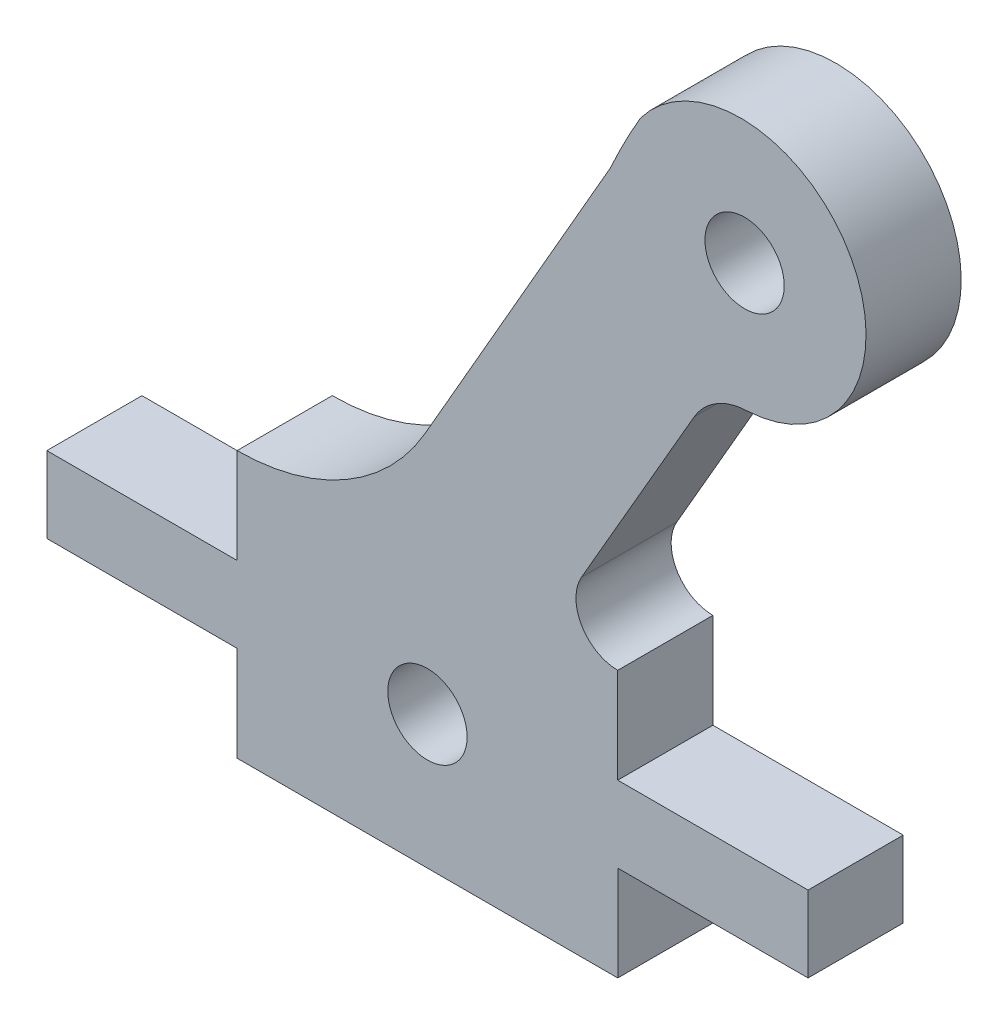
ISO-10303-21;
HEADER;
FILE_DESCRIPTION(('STEP AP214'),'2;1');
FILE_NAME('part.step','',(''),(''),'','','');
FILE_SCHEMA(('AUTOMOTIVE_DESIGN { 1 0 10303 214 1 1 1 1 }'));
ENDSEC;
DATA;
#1=APPLICATION_CONTEXT('core data for automotive mechanical design processes');
#2=APPLICATION_PROTOCOL_DEFINITION('international standard','automotive_design',2000,#1);
#3=PRODUCT_CONTEXT('',#1,'mechanical');
#4=PRODUCT('Part','Part','',(#3));
#5=PRODUCT_RELATED_PRODUCT_CATEGORY('part','',(#4));
#6=PRODUCT_DEFINITION_FORMATION('','',#4);
#7=PRODUCT_DEFINITION_CONTEXT('part definition',#1,'design');
#8=PRODUCT_DEFINITION('design','',#6,#7);
#9=PRODUCT_DEFINITION_SHAPE('','',#8);
#10=(LENGTH_UNIT() NAMED_UNIT(*) SI_UNIT(.MILLI.,.METRE.));
#11=(NAMED_UNIT(*) PLANE_ANGLE_UNIT() SI_UNIT($,.RADIAN.));
#12=(NAMED_UNIT(*) SI_UNIT($,.STERADIAN.) SOLID_ANGLE_UNIT());
#13=UNCERTAINTY_MEASURE_WITH_UNIT(LENGTH_MEASURE(1.E-05),#10,'distance_accuracy_value','');
#14=(GEOMETRIC_REPRESENTATION_CONTEXT(3) GLOBAL_UNCERTAINTY_ASSIGNED_CONTEXT((#13)) GLOBAL_UNIT_ASSIGNED_CONTEXT((#10,
#11,#12)) REPRESENTATION_CONTEXT('',''));
#15=CARTESIAN_POINT('',(0.,0.,0.));
#16=DIRECTION('',(0.,0.,1.));
#17=DIRECTION('',(1.,0.,0.));
#18=AXIS2_PLACEMENT_3D('',#15,#16,#17);
#19=CARTESIAN_POINT('',(194.996929612891,100.808133255801,3.));
#20=DIRECTION('',(0.,0.,1.));
#21=DIRECTION('',(1.,0.,0.));
#22=AXIS2_PLACEMENT_3D('',#19,#20,#21);
#23=PLANE('',#22);
#24=CARTESIAN_POINT('',(188.997425419136,95.2910740345503,3.));
#25=DIRECTION('',(0.,0.,1.));
#26=DIRECTION('',(1.,0.,0.));
#27=AXIS2_PLACEMENT_3D('',#24,#25,#26);
#28=CIRCLE('',#27,1.25000000000004);
#29=CARTESIAN_POINT('',(190.247425419136,95.2910740345503,3.));
#30=VERTEX_POINT('',#29);
#31=EDGE_CURVE('E194',#30,#30,#28,.T.);
#32=ORIENTED_EDGE('',*,*,#31,.F.);
#33=EDGE_LOOP('',(#32));
#34=FACE_BOUND('',#33,.T.);
#35=DIRECTION('',(0.000220609882311119,-0.99999997566564,0.));
#36=VECTOR('',#35,1.);
#37=CARTESIAN_POINT('',(176.997300124418,96.4900442855765,3.));
#38=LINE('',#37,#36);
#39=CARTESIAN_POINT('',(176.997300124418,96.4900442855765,3.));
#40=VERTEX_POINT('',#39);
#41=CARTESIAN_POINT('',(176.997829455042,94.0906476421746,3.));
#42=VERTEX_POINT('',#41);
#43=EDGE_CURVE('E225',#40,#42,#38,.T.);
#44=ORIENTED_EDGE('',*,*,#43,.T.);
#45=DIRECTION('',(1.,0.,0.));
#46=VECTOR('',#45,1.);
#47=CARTESIAN_POINT('',(176.997829455042,94.0906476421746,3.));
#48=LINE('',#47,#46);
#49=CARTESIAN_POINT('',(182.997829455042,94.0906476421746,3.));
#50=VERTEX_POINT('',#49);
#51=EDGE_CURVE('E123',#42,#50,#48,.T.);
#52=ORIENTED_EDGE('',*,*,#51,.T.);
#53=DIRECTION('',(0.,-1.,0.));
#54=VECTOR('',#53,1.);
#55=CARTESIAN_POINT('',(182.997829455042,94.0906476421746,3.));
#56=LINE('',#55,#54);
#57=CARTESIAN_POINT('',(182.997829455042,91.0906476421746,3.));
#58=VERTEX_POINT('',#57);
#59=EDGE_CURVE('E270',#50,#58,#56,.T.);
#60=ORIENTED_EDGE('',*,*,#59,.T.);
#61=DIRECTION('',(1.,0.,0.));
#62=VECTOR('',#61,1.);
#63=CARTESIAN_POINT('',(182.997829455042,91.0906476421746,3.));
#64=LINE('',#63,#62);
#65=CARTESIAN_POINT('',(194.997829455041,91.0906476421746,3.));
#66=VERTEX_POINT('',#65);
#67=EDGE_CURVE('E289',#58,#66,#64,.T.);
#68=ORIENTED_EDGE('',*,*,#67,.T.);
#69=DIRECTION('',(0.,1.,0.));
#70=VECTOR('',#69,1.);
#71=CARTESIAN_POINT('',(194.997829455041,91.0906476421746,3.));
#72=LINE('',#71,#70);
#73=CARTESIAN_POINT('',(194.997829455041,94.0906476421746,3.));
#74=VERTEX_POINT('',#73);
#75=EDGE_CURVE('E286',#66,#74,#72,.T.);
#76=ORIENTED_EDGE('',*,*,#75,.T.);
#77=DIRECTION('',(1.,0.,0.));
#78=VECTOR('',#77,1.);
#79=CARTESIAN_POINT('',(194.997829455041,94.0906476421746,3.));
#80=LINE('',#79,#78);
#81=CARTESIAN_POINT('',(200.997480003679,94.0906476421746,3.));
#82=VERTEX_POINT('',#81);
#83=EDGE_CURVE('E288',#74,#82,#80,.T.);
#84=ORIENTED_EDGE('',*,*,#83,.T.);
#85=DIRECTION('',(-5.30026497254156E-05,0.99999999859536,0.));
#86=VECTOR('',#85,1.);
#87=CARTESIAN_POINT('',(200.997352724358,96.4920241961428,3.));
#88=LINE('',#87,#86);
#89=CARTESIAN_POINT('',(200.997352724358,96.4920241961428,3.));
#90=VERTEX_POINT('',#89);
#91=EDGE_CURVE('E291',#82,#90,#88,.T.);
#92=ORIENTED_EDGE('',*,*,#91,.T.);
#93=DIRECTION('',(-0.999999996597197,-8.24960924929654E-05,0.));
#94=VECTOR('',#93,1.);
#95=CARTESIAN_POINT('',(200.997352724358,96.4920241961428,3.));
#96=LINE('',#95,#94);
#97=CARTESIAN_POINT('',(194.997268863695,96.491529212668,3.));
#98=VERTEX_POINT('',#97);
#99=EDGE_CURVE('E297',#90,#98,#96,.T.);
#100=ORIENTED_EDGE('',*,*,#99,.T.);
#101=DIRECTION('',(-5.89261960132974E-05,0.999999998263852,0.));
#102=VECTOR('',#101,1.);
#103=CARTESIAN_POINT('',(194.997268863695,96.491529212668,3.));
#104=LINE('',#103,#102);
#105=CARTESIAN_POINT('',(194.997092082636,99.491571148833,3.));
#106=VERTEX_POINT('',#105);
#107=EDGE_CURVE('E299',#98,#106,#104,.T.);
#108=ORIENTED_EDGE('',*,*,#107,.T.);
#109=CARTESIAN_POINT('',(194.996929612891,100.808133255801,3.));
#110=DIRECTION('',(0.,0.,-1.));
#111=DIRECTION('',(1.,0.,0.));
#112=AXIS2_PLACEMENT_3D('',#109,#110,#111);
#113=CIRCLE('',#112,1.31656211699297);
#114=CARTESIAN_POINT('',(193.85671948209,101.466355608445,3.));
#115=VERTEX_POINT('',#114);
#116=EDGE_CURVE('E301',#106,#115,#113,.T.);
#117=ORIENTED_EDGE('',*,*,#116,.T.);
#118=DIRECTION('',(0.499921488933329,0.866070727425124,0.));
#119=VECTOR('',#118,1.);
#120=CARTESIAN_POINT('',(193.85671948209,101.466355608445,3.));
#121=LINE('',#120,#119);
#122=CARTESIAN_POINT('',(197.405251992781,107.613881171676,3.));
#123=VERTEX_POINT('',#122);
#124=EDGE_CURVE('E303',#115,#123,#121,.T.);
#125=ORIENTED_EDGE('',*,*,#124,.T.);
#126=CARTESIAN_POINT('',(199.137418021574,106.61391705798,3.));
#127=DIRECTION('',(0.,0.,-1.));
#128=DIRECTION('',(1.,0.,0.));
#129=AXIS2_PLACEMENT_3D('',#126,#127,#128);
#130=CIRCLE('',#129,2.00008184332095);
#131=CARTESIAN_POINT('',(199.090346419336,108.613444913311,3.));
#132=VERTEX_POINT('',#131);
#133=EDGE_CURVE('E305',#123,#132,#130,.T.);
#134=ORIENTED_EDGE('',*,*,#133,.T.);
#135=CARTESIAN_POINT('',(198.874886601451,112.558461432084,3.));
#136=DIRECTION('',(0.,0.,1.));
#137=DIRECTION('',(1.,0.,0.));
#138=AXIS2_PLACEMENT_3D('',#135,#136,#137);
#139=CIRCLE('',#138,3.95089588150789);
#140=CARTESIAN_POINT('',(195.715093083924,114.930229378809,3.));
#141=VERTEX_POINT('',#140);
#142=EDGE_CURVE('E307',#132,#141,#139,.T.);
#143=ORIENTED_EDGE('',*,*,#142,.T.);
#144=CARTESIAN_POINT('',(213.127289572834,104.765338451435,3.));
#145=DIRECTION('',(0.,0.,1.));
#146=DIRECTION('',(1.,0.,0.));
#147=AXIS2_PLACEMENT_3D('',#144,#145,#146);
#148=CIRCLE('',#147,20.1620830802231);
#149=CARTESIAN_POINT('',(194.764370404593,113.090768996125,3.));
#150=VERTEX_POINT('',#149);
#151=EDGE_CURVE('E309',#141,#150,#148,.T.);
#152=ORIENTED_EDGE('',*,*,#151,.T.);
#153=DIRECTION('',(-0.498063420856124,-0.867140604980009,0.));
#154=VECTOR('',#153,1.);
#155=CARTESIAN_POINT('',(194.764370404593,113.090768996125,3.));
#156=LINE('',#155,#154);
#157=CARTESIAN_POINT('',(188.915903996961,102.908445849002,3.));
#158=VERTEX_POINT('',#157);
#159=EDGE_CURVE('E172',#150,#158,#156,.T.);
#160=ORIENTED_EDGE('',*,*,#159,.T.);
#161=CARTESIAN_POINT('',(182.99665481551,106.325156903223,3.));
#162=DIRECTION('',(0.,0.,-1.));
#163=DIRECTION('',(1.,0.,0.));
#164=AXIS2_PLACEMENT_3D('',#161,#162,#163);
#165=CIRCLE('',#164,6.83457572202901);
#166=CARTESIAN_POINT('',(182.997065782668,99.4905811935497,3.));
#167=VERTEX_POINT('',#166);
#168=EDGE_CURVE('E166',#158,#167,#165,.T.);
#169=ORIENTED_EDGE('',*,*,#168,.T.);
#170=DIRECTION('',(0.000106065987992372,-0.999999994375003,0.));
#171=VECTOR('',#170,1.);
#172=CARTESIAN_POINT('',(182.997065782668,99.4905811935497,3.));
#173=LINE('',#172,#171);
#174=CARTESIAN_POINT('',(182.99738398508,96.4905392690514,3.));
#175=VERTEX_POINT('',#174);
#176=EDGE_CURVE('E170',#167,#175,#173,.T.);
#177=ORIENTED_EDGE('',*,*,#176,.T.);
#178=DIRECTION('',(-0.999999996597197,-8.24960925068426E-05,0.));
#179=VECTOR('',#178,1.);
#180=CARTESIAN_POINT('',(182.99738398508,96.4905392690514,3.));
#181=LINE('',#180,#179);
#182=EDGE_CURVE('E50',#175,#40,#181,.T.);
#183=ORIENTED_EDGE('',*,*,#182,.T.);
#184=EDGE_LOOP('',(#44,#52,#60,#68,#76,#84,#92,#100,#108,#117,#125,#134,#143,#152,#160,#169,
#177,#183));
#185=FACE_BOUND('',#184,.T.);
#186=CARTESIAN_POINT('',(198.996042034731,112.6123381241,3.));
#187=DIRECTION('',(0.,0.,1.));
#188=DIRECTION('',(1.,0.,0.));
#189=AXIS2_PLACEMENT_3D('',#186,#187,#188);
#190=CIRCLE('',#189,1.25000000000001);
#191=CARTESIAN_POINT('',(200.246042034731,112.6123381241,3.));
#192=VERTEX_POINT('',#191);
#193=EDGE_CURVE('E351',#192,#192,#190,.T.);
#194=ORIENTED_EDGE('',*,*,#193,.F.);
#195=EDGE_LOOP('',(#194));
#196=FACE_BOUND('',#195,.T.);
#197=ADVANCED_FACE('F33',(#34,#185,#196),#23,.T.);
#198=CARTESIAN_POINT('',(194.996929612891,100.808133255801,0.));
#199=DIRECTION('',(0.,0.,1.));
#200=DIRECTION('',(1.,0.,0.));
#201=AXIS2_PLACEMENT_3D('',#198,#199,#200);
#202=PLANE('',#201);
#203=DIRECTION('',(0.000220609882311119,-0.99999997566564,0.));
#204=VECTOR('',#203,1.);
#205=CARTESIAN_POINT('',(176.997300124418,96.4900442855765,0.));
#206=LINE('',#205,#204);
#207=CARTESIAN_POINT('',(176.997300124418,96.4900442855765,0.));
#208=VERTEX_POINT('',#207);
#209=CARTESIAN_POINT('',(176.997829455042,94.0906476421746,0.));
#210=VERTEX_POINT('',#209);
#211=EDGE_CURVE('E190',#208,#210,#206,.T.);
#212=ORIENTED_EDGE('',*,*,#211,.F.);
#213=DIRECTION('',(-0.999999996597197,-8.24960925068426E-05,0.));
#214=VECTOR('',#213,1.);
#215=CARTESIAN_POINT('',(182.99738398508,96.4905392690514,0.));
#216=LINE('',#215,#214);
#217=CARTESIAN_POINT('',(182.99738398508,96.4905392690514,0.));
#218=VERTEX_POINT('',#217);
#219=EDGE_CURVE('E115',#218,#208,#216,.T.);
#220=ORIENTED_EDGE('',*,*,#219,.F.);
#221=DIRECTION('',(0.000106065987992372,-0.999999994375003,0.));
#222=VECTOR('',#221,1.);
#223=CARTESIAN_POINT('',(182.997065782668,99.4905811935497,0.));
#224=LINE('',#223,#222);
#225=CARTESIAN_POINT('',(182.997065782668,99.4905811935497,0.));
#226=VERTEX_POINT('',#225);
#227=EDGE_CURVE('E109',#226,#218,#224,.T.);
#228=ORIENTED_EDGE('',*,*,#227,.F.);
#229=CARTESIAN_POINT('',(182.99665481551,106.325156903223,0.));
#230=DIRECTION('',(0.,0.,-1.));
#231=DIRECTION('',(1.,0.,0.));
#232=AXIS2_PLACEMENT_3D('',#229,#230,#231);
#233=CIRCLE('',#232,6.83457572202901);
#234=CARTESIAN_POINT('',(188.915903996961,102.908445849002,0.));
#235=VERTEX_POINT('',#234);
#236=EDGE_CURVE('E180',#235,#226,#233,.T.);
#237=ORIENTED_EDGE('',*,*,#236,.F.);
#238=DIRECTION('',(-0.498063420856124,-0.867140604980009,0.));
#239=VECTOR('',#238,1.);
#240=CARTESIAN_POINT('',(194.764370404593,113.090768996125,0.));
#241=LINE('',#240,#239);
#242=CARTESIAN_POINT('',(194.764370404593,113.090768996125,0.));
#243=VERTEX_POINT('',#242);
#244=EDGE_CURVE('E220',#243,#235,#241,.T.);
#245=ORIENTED_EDGE('',*,*,#244,.F.);
#246=CARTESIAN_POINT('',(213.127289572834,104.765338451435,0.));
#247=DIRECTION('',(0.,0.,1.));
#248=DIRECTION('',(1.,0.,0.));
#249=AXIS2_PLACEMENT_3D('',#246,#247,#248);
#250=CIRCLE('',#249,20.1620830802231);
#251=CARTESIAN_POINT('',(195.715093083924,114.930229378809,0.));
#252=VERTEX_POINT('',#251);
#253=EDGE_CURVE('E218',#252,#243,#250,.T.);
#254=ORIENTED_EDGE('',*,*,#253,.F.);
#255=CARTESIAN_POINT('',(198.874886601451,112.558461432084,0.));
#256=DIRECTION('',(0.,0.,1.));
#257=DIRECTION('',(1.,0.,0.));
#258=AXIS2_PLACEMENT_3D('',#255,#256,#257);
#259=CIRCLE('',#258,3.95089588150789);
#260=CARTESIAN_POINT('',(199.090346419336,108.613444913311,0.));
#261=VERTEX_POINT('',#260);
#262=EDGE_CURVE('E216',#261,#252,#259,.T.);
#263=ORIENTED_EDGE('',*,*,#262,.F.);
#264=CARTESIAN_POINT('',(199.137418021574,106.61391705798,0.));
#265=DIRECTION('',(0.,0.,-1.));
#266=DIRECTION('',(1.,0.,0.));
#267=AXIS2_PLACEMENT_3D('',#264,#265,#266);
#268=CIRCLE('',#267,2.00008184332095);
#269=CARTESIAN_POINT('',(197.405251992781,107.613881171676,0.));
#270=VERTEX_POINT('',#269);
#271=EDGE_CURVE('E214',#270,#261,#268,.T.);
#272=ORIENTED_EDGE('',*,*,#271,.F.);
#273=DIRECTION('',(0.499921488933329,0.866070727425124,0.));
#274=VECTOR('',#273,1.);
#275=CARTESIAN_POINT('',(193.85671948209,101.466355608445,0.));
#276=LINE('',#275,#274);
#277=CARTESIAN_POINT('',(193.85671948209,101.466355608445,0.));
#278=VERTEX_POINT('',#277);
#279=EDGE_CURVE('E212',#278,#270,#276,.T.);
#280=ORIENTED_EDGE('',*,*,#279,.F.);
#281=CARTESIAN_POINT('',(194.996929612891,100.808133255801,0.));
#282=DIRECTION('',(0.,0.,-1.));
#283=DIRECTION('',(1.,0.,0.));
#284=AXIS2_PLACEMENT_3D('',#281,#282,#283);
#285=CIRCLE('',#284,1.31656211699297);
#286=CARTESIAN_POINT('',(194.997092082636,99.491571148833,0.));
#287=VERTEX_POINT('',#286);
#288=EDGE_CURVE('E210',#287,#278,#285,.T.);
#289=ORIENTED_EDGE('',*,*,#288,.F.);
#290=DIRECTION('',(-5.89261960132974E-05,0.999999998263852,0.));
#291=VECTOR('',#290,1.);
#292=CARTESIAN_POINT('',(194.997268863695,96.491529212668,0.));
#293=LINE('',#292,#291);
#294=CARTESIAN_POINT('',(194.997268863695,96.491529212668,0.));
#295=VERTEX_POINT('',#294);
#296=EDGE_CURVE('E208',#295,#287,#293,.T.);
#297=ORIENTED_EDGE('',*,*,#296,.F.);
#298=DIRECTION('',(-0.999999996597197,-8.24960924929654E-05,0.));
#299=VECTOR('',#298,1.);
#300=CARTESIAN_POINT('',(200.997352724358,96.4920241961428,0.));
#301=LINE('',#300,#299);
#302=CARTESIAN_POINT('',(200.997352724358,96.4920241961428,0.));
#303=VERTEX_POINT('',#302);
#304=EDGE_CURVE('E206',#303,#295,#301,.T.);
#305=ORIENTED_EDGE('',*,*,#304,.F.);
#306=DIRECTION('',(-5.30026497254156E-05,0.99999999859536,0.));
#307=VECTOR('',#306,1.);
#308=CARTESIAN_POINT('',(200.997352724358,96.4920241961428,0.));
#309=LINE('',#308,#307);
#310=CARTESIAN_POINT('',(200.997480003679,94.0906476421746,0.));
#311=VERTEX_POINT('',#310);
#312=EDGE_CURVE('E204',#311,#303,#309,.T.);
#313=ORIENTED_EDGE('',*,*,#312,.F.);
#314=DIRECTION('',(1.,0.,0.));
#315=VECTOR('',#314,1.);
#316=CARTESIAN_POINT('',(194.997829455041,94.0906476421746,0.));
#317=LINE('',#316,#315);
#318=CARTESIAN_POINT('',(194.997829455041,94.0906476421746,0.));
#319=VERTEX_POINT('',#318);
#320=EDGE_CURVE('E202',#319,#311,#317,.T.);
#321=ORIENTED_EDGE('',*,*,#320,.F.);
#322=DIRECTION('',(0.,1.,0.));
#323=VECTOR('',#322,1.);
#324=CARTESIAN_POINT('',(194.997829455041,91.0906476421746,0.));
#325=LINE('',#324,#323);
#326=CARTESIAN_POINT('',(194.997829455041,91.0906476421746,0.));
#327=VERTEX_POINT('',#326);
#328=EDGE_CURVE('E200',#327,#319,#325,.T.);
#329=ORIENTED_EDGE('',*,*,#328,.F.);
#330=DIRECTION('',(1.,0.,0.));
#331=VECTOR('',#330,1.);
#332=CARTESIAN_POINT('',(182.997829455042,91.0906476421746,0.));
#333=LINE('',#332,#331);
#334=CARTESIAN_POINT('',(182.997829455042,91.0906476421746,0.));
#335=VERTEX_POINT('',#334);
#336=EDGE_CURVE('E198',#335,#327,#333,.T.);
#337=ORIENTED_EDGE('',*,*,#336,.F.);
#338=DIRECTION('',(0.,-1.,0.));
#339=VECTOR('',#338,1.);
#340=CARTESIAN_POINT('',(182.997829455042,94.0906476421746,0.));
#341=LINE('',#340,#339);
#342=CARTESIAN_POINT('',(182.997829455042,94.0906476421746,0.));
#343=VERTEX_POINT('',#342);
#344=EDGE_CURVE('E196',#343,#335,#341,.T.);
#345=ORIENTED_EDGE('',*,*,#344,.F.);
#346=DIRECTION('',(1.,0.,0.));
#347=VECTOR('',#346,1.);
#348=CARTESIAN_POINT('',(176.997829455042,94.0906476421746,0.));
#349=LINE('',#348,#347);
#350=EDGE_CURVE('E193',#210,#343,#349,.T.);
#351=ORIENTED_EDGE('',*,*,#350,.F.);
#352=EDGE_LOOP('',(#212,#220,#228,#237,#245,#254,#263,#272,#280,#289,#297,#305,#313,#321,#329,
#337,#345,#351));
#353=FACE_BOUND('',#352,.T.);
#354=CARTESIAN_POINT('',(188.997425419136,95.2910740345503,0.));
#355=DIRECTION('',(0.,0.,1.));
#356=DIRECTION('',(1.,0.,0.));
#357=AXIS2_PLACEMENT_3D('',#354,#355,#356);
#358=CIRCLE('',#357,1.25000000000004);
#359=CARTESIAN_POINT('',(190.247425419136,95.2910740345503,0.));
#360=VERTEX_POINT('',#359);
#361=EDGE_CURVE('E357',#360,#360,#358,.T.);
#362=ORIENTED_EDGE('',*,*,#361,.T.);
#363=EDGE_LOOP('',(#362));
#364=FACE_BOUND('',#363,.T.);
#365=CARTESIAN_POINT('',(198.996042034731,112.6123381241,0.));
#366=DIRECTION('',(0.,0.,1.));
#367=DIRECTION('',(1.,0.,0.));
#368=AXIS2_PLACEMENT_3D('',#365,#366,#367);
#369=CIRCLE('',#368,1.25000000000001);
#370=CARTESIAN_POINT('',(200.246042034731,112.6123381241,0.));
#371=VERTEX_POINT('',#370);
#372=EDGE_CURVE('E354',#371,#371,#369,.T.);
#373=ORIENTED_EDGE('',*,*,#372,.T.);
#374=EDGE_LOOP('',(#373));
#375=FACE_BOUND('',#374,.T.);
#376=ADVANCED_FACE('F274',(#353,#364,#375),#202,.F.);
#377=CARTESIAN_POINT('',(176.997300124418,96.4900442855765,3.));
#378=DIRECTION('',(0.999999975665639,0.000220609882311119,0.));
#379=DIRECTION('',(-0.000220609882311119,0.99999997566564,0.));
#380=AXIS2_PLACEMENT_3D('',#377,#378,#379);
#381=PLANE('',#380);
#382=ORIENTED_EDGE('',*,*,#211,.T.);
#383=DIRECTION('',(0.,0.,-1.));
#384=VECTOR('',#383,1.);
#385=CARTESIAN_POINT('',(176.997829455042,94.0906476421746,3.));
#386=LINE('',#385,#384);
#387=EDGE_CURVE('E11',#42,#210,#386,.T.);
#388=ORIENTED_EDGE('',*,*,#387,.F.);
#389=ORIENTED_EDGE('',*,*,#43,.F.);
#390=DIRECTION('',(0.,0.,-1.));
#391=VECTOR('',#390,1.);
#392=CARTESIAN_POINT('',(176.997300124418,96.4900442855765,3.));
#393=LINE('',#392,#391);
#394=EDGE_CURVE('E186',#40,#208,#393,.T.);
#395=ORIENTED_EDGE('',*,*,#394,.T.);
#396=EDGE_LOOP('',(#382,#388,#389,#395));
#397=FACE_BOUND('',#396,.T.);
#398=ADVANCED_FACE('F35',(#397),#381,.F.);
#399=CARTESIAN_POINT('',(176.997829455042,94.0906476421746,3.));
#400=DIRECTION('',(0.,1.,0.));
#401=DIRECTION('',(0.,0.,1.));
#402=AXIS2_PLACEMENT_3D('',#399,#400,#401);
#403=PLANE('',#402);
#404=ORIENTED_EDGE('',*,*,#350,.T.);
#405=DIRECTION('',(0.,0.,-1.));
#406=VECTOR('',#405,1.);
#407=CARTESIAN_POINT('',(182.997829455042,94.0906476421746,3.));
#408=LINE('',#407,#406);
#409=EDGE_CURVE('E42',#50,#343,#408,.T.);
#410=ORIENTED_EDGE('',*,*,#409,.F.);
#411=ORIENTED_EDGE('',*,*,#51,.F.);
#412=ORIENTED_EDGE('',*,*,#387,.T.);
#413=EDGE_LOOP('',(#404,#410,#411,#412));
#414=FACE_BOUND('',#413,.T.);
#415=ADVANCED_FACE('F510',(#414),#403,.F.);
#416=CARTESIAN_POINT('',(182.997829455042,94.0906476421746,3.));
#417=DIRECTION('',(1.,0.,0.));
#418=DIRECTION('',(0.,0.,-1.));
#419=AXIS2_PLACEMENT_3D('',#416,#417,#418);
#420=PLANE('',#419);
#421=ORIENTED_EDGE('',*,*,#344,.T.);
#422=DIRECTION('',(0.,0.,-1.));
#423=VECTOR('',#422,1.);
#424=CARTESIAN_POINT('',(182.997829455042,91.0906476421746,3.));
#425=LINE('',#424,#423);
#426=EDGE_CURVE('E262',#58,#335,#425,.T.);
#427=ORIENTED_EDGE('',*,*,#426,.F.);
#428=ORIENTED_EDGE('',*,*,#59,.F.);
#429=ORIENTED_EDGE('',*,*,#409,.T.);
#430=EDGE_LOOP('',(#421,#427,#428,#429));
#431=FACE_BOUND('',#430,.T.);
#432=ADVANCED_FACE('F268',(#431),#420,.F.);
#433=CARTESIAN_POINT('',(182.997829455042,91.0906476421746,3.));
#434=DIRECTION('',(0.,1.,0.));
#435=DIRECTION('',(0.,0.,1.));
#436=AXIS2_PLACEMENT_3D('',#433,#434,#435);
#437=PLANE('',#436);
#438=ORIENTED_EDGE('',*,*,#336,.T.);
#439=DIRECTION('',(0.,0.,-1.));
#440=VECTOR('',#439,1.);
#441=CARTESIAN_POINT('',(194.997829455041,91.0906476421746,3.));
#442=LINE('',#441,#440);
#443=EDGE_CURVE('E259',#66,#327,#442,.T.);
#444=ORIENTED_EDGE('',*,*,#443,.F.);
#445=ORIENTED_EDGE('',*,*,#67,.F.);
#446=ORIENTED_EDGE('',*,*,#426,.T.);
#447=EDGE_LOOP('',(#438,#444,#445,#446));
#448=FACE_BOUND('',#447,.T.);
#449=ADVANCED_FACE('F280',(#448),#437,.F.);
#450=CARTESIAN_POINT('',(194.997829455041,91.0906476421746,3.));
#451=DIRECTION('',(-1.,0.,0.));
#452=DIRECTION('',(0.,0.,1.));
#453=AXIS2_PLACEMENT_3D('',#450,#451,#452);
#454=PLANE('',#453);
#455=ORIENTED_EDGE('',*,*,#328,.T.);
#456=DIRECTION('',(0.,0.,-1.));
#457=VECTOR('',#456,1.);
#458=CARTESIAN_POINT('',(194.997829455041,94.0906476421746,3.));
#459=LINE('',#458,#457);
#460=EDGE_CURVE('E256',#74,#319,#459,.T.);
#461=ORIENTED_EDGE('',*,*,#460,.F.);
#462=ORIENTED_EDGE('',*,*,#75,.F.);
#463=ORIENTED_EDGE('',*,*,#443,.T.);
#464=EDGE_LOOP('',(#455,#461,#462,#463));
#465=FACE_BOUND('',#464,.T.);
#466=ADVANCED_FACE('F284',(#465),#454,.F.);
#467=CARTESIAN_POINT('',(194.997829455041,94.0906476421746,3.));
#468=DIRECTION('',(0.,1.,0.));
#469=DIRECTION('',(0.,0.,1.));
#470=AXIS2_PLACEMENT_3D('',#467,#468,#469);
#471=PLANE('',#470);
#472=ORIENTED_EDGE('',*,*,#320,.T.);
#473=DIRECTION('',(0.,0.,-1.));
#474=VECTOR('',#473,1.);
#475=CARTESIAN_POINT('',(200.997480003679,94.0906476421746,3.));
#476=LINE('',#475,#474);
#477=EDGE_CURVE('E253',#82,#311,#476,.T.);
#478=ORIENTED_EDGE('',*,*,#477,.F.);
#479=ORIENTED_EDGE('',*,*,#83,.F.);
#480=ORIENTED_EDGE('',*,*,#460,.T.);
#481=EDGE_LOOP('',(#472,#478,#479,#480));
#482=FACE_BOUND('',#481,.T.);
#483=ADVANCED_FACE('F475',(#482),#471,.F.);
#484=CARTESIAN_POINT('',(200.997352724358,96.4920241961428,3.));
#485=DIRECTION('',(-0.999999998595359,-5.30026497254156E-05,0.));
#486=DIRECTION('',(5.30026497254156E-05,-0.99999999859536,0.));
#487=AXIS2_PLACEMENT_3D('',#484,#485,#486);
#488=PLANE('',#487);
#489=ORIENTED_EDGE('',*,*,#312,.T.);
#490=DIRECTION('',(0.,0.,-1.));
#491=VECTOR('',#490,1.);
#492=CARTESIAN_POINT('',(200.997352724358,96.4920241961428,3.));
#493=LINE('',#492,#491);
#494=EDGE_CURVE('E250',#90,#303,#493,.T.);
#495=ORIENTED_EDGE('',*,*,#494,.F.);
#496=ORIENTED_EDGE('',*,*,#91,.F.);
#497=ORIENTED_EDGE('',*,*,#477,.T.);
#498=EDGE_LOOP('',(#489,#495,#496,#497));
#499=FACE_BOUND('',#498,.T.);
#500=ADVANCED_FACE('F465',(#499),#488,.F.);
#501=CARTESIAN_POINT('',(200.997352724358,96.4920241961428,3.));
#502=DIRECTION('',(8.24960924929654E-05,-0.999999996597197,0.));
#503=DIRECTION('',(0.999999996597197,8.24960924929654E-05,0.));
#504=AXIS2_PLACEMENT_3D('',#501,#502,#503);
#505=PLANE('',#504);
#506=ORIENTED_EDGE('',*,*,#304,.T.);
#507=DIRECTION('',(0.,0.,-1.));
#508=VECTOR('',#507,1.);
#509=CARTESIAN_POINT('',(194.997268863695,96.491529212668,3.));
#510=LINE('',#509,#508);
#511=EDGE_CURVE('E247',#98,#295,#510,.T.);
#512=ORIENTED_EDGE('',*,*,#511,.F.);
#513=ORIENTED_EDGE('',*,*,#99,.F.);
#514=ORIENTED_EDGE('',*,*,#494,.T.);
#515=EDGE_LOOP('',(#506,#512,#513,#514));
#516=FACE_BOUND('',#515,.T.);
#517=ADVANCED_FACE('F455',(#516),#505,.F.);
#518=CARTESIAN_POINT('',(194.997268863695,96.491529212668,3.));
#519=DIRECTION('',(-0.999999998263852,-5.89261960132974E-05,0.));
#520=DIRECTION('',(5.89261960132974E-05,-0.999999998263852,0.));
#521=AXIS2_PLACEMENT_3D('',#518,#519,#520);
#522=PLANE('',#521);
#523=ORIENTED_EDGE('',*,*,#296,.T.);
#524=DIRECTION('',(0.,0.,-1.));
#525=VECTOR('',#524,1.);
#526=CARTESIAN_POINT('',(194.997092082636,99.491571148833,3.));
#527=LINE('',#526,#525);
#528=EDGE_CURVE('E244',#106,#287,#527,.T.);
#529=ORIENTED_EDGE('',*,*,#528,.F.);
#530=ORIENTED_EDGE('',*,*,#107,.F.);
#531=ORIENTED_EDGE('',*,*,#511,.T.);
#532=EDGE_LOOP('',(#523,#529,#530,#531));
#533=FACE_BOUND('',#532,.T.);
#534=ADVANCED_FACE('F445',(#533),#522,.F.);
#535=CARTESIAN_POINT('',(194.996929612891,100.808133255801,3.));
#536=DIRECTION('',(0.,0.,-1.));
#537=DIRECTION('',(-1.,0.,0.));
#538=AXIS2_PLACEMENT_3D('',#535,#536,#537);
#539=CYLINDRICAL_SURFACE('',#538,1.31656211699297);
#540=ORIENTED_EDGE('',*,*,#288,.T.);
#541=DIRECTION('',(0.,0.,-1.));
#542=VECTOR('',#541,1.);
#543=CARTESIAN_POINT('',(193.85671948209,101.466355608445,3.));
#544=LINE('',#543,#542);
#545=EDGE_CURVE('E241',#115,#278,#544,.T.);
#546=ORIENTED_EDGE('',*,*,#545,.F.);
#547=ORIENTED_EDGE('',*,*,#116,.F.);
#548=ORIENTED_EDGE('',*,*,#528,.T.);
#549=EDGE_LOOP('',(#540,#546,#547,#548));
#550=FACE_BOUND('',#549,.T.);
#551=ADVANCED_FACE('F435',(#550),#539,.F.);
#552=CARTESIAN_POINT('',(193.85671948209,101.466355608445,3.));
#553=DIRECTION('',(-0.866070727425124,0.499921488933329,0.));
#554=DIRECTION('',(-0.499921488933329,-0.866070727425124,0.));
#555=AXIS2_PLACEMENT_3D('',#552,#553,#554);
#556=PLANE('',#555);
#557=ORIENTED_EDGE('',*,*,#279,.T.);
#558=DIRECTION('',(0.,0.,-1.));
#559=VECTOR('',#558,1.);
#560=CARTESIAN_POINT('',(197.405251992781,107.613881171676,3.));
#561=LINE('',#560,#559);
#562=EDGE_CURVE('E238',#123,#270,#561,.T.);
#563=ORIENTED_EDGE('',*,*,#562,.F.);
#564=ORIENTED_EDGE('',*,*,#124,.F.);
#565=ORIENTED_EDGE('',*,*,#545,.T.);
#566=EDGE_LOOP('',(#557,#563,#564,#565));
#567=FACE_BOUND('',#566,.T.);
#568=ADVANCED_FACE('F425',(#567),#556,.F.);
#569=CARTESIAN_POINT('',(199.137418021574,106.61391705798,3.));
#570=DIRECTION('',(0.,0.,-1.));
#571=DIRECTION('',(-1.,0.,0.));
#572=AXIS2_PLACEMENT_3D('',#569,#570,#571);
#573=CYLINDRICAL_SURFACE('',#572,2.00008184332095);
#574=ORIENTED_EDGE('',*,*,#271,.T.);
#575=DIRECTION('',(0.,0.,-1.));
#576=VECTOR('',#575,1.);
#577=CARTESIAN_POINT('',(199.090346419336,108.613444913311,3.));
#578=LINE('',#577,#576);
#579=EDGE_CURVE('E235',#132,#261,#578,.T.);
#580=ORIENTED_EDGE('',*,*,#579,.F.);
#581=ORIENTED_EDGE('',*,*,#133,.F.);
#582=ORIENTED_EDGE('',*,*,#562,.T.);
#583=EDGE_LOOP('',(#574,#580,#581,#582));
#584=FACE_BOUND('',#583,.T.);
#585=ADVANCED_FACE('F415',(#584),#573,.F.);
#586=CARTESIAN_POINT('',(198.874886601451,112.558461432084,3.));
#587=DIRECTION('',(0.,0.,-1.));
#588=DIRECTION('',(-1.,0.,0.));
#589=AXIS2_PLACEMENT_3D('',#586,#587,#588);
#590=CYLINDRICAL_SURFACE('',#589,3.95089588150789);
#591=ORIENTED_EDGE('',*,*,#262,.T.);
#592=DIRECTION('',(0.,0.,-1.));
#593=VECTOR('',#592,1.);
#594=CARTESIAN_POINT('',(195.715093083924,114.930229378809,3.));
#595=LINE('',#594,#593);
#596=EDGE_CURVE('E232',#141,#252,#595,.T.);
#597=ORIENTED_EDGE('',*,*,#596,.F.);
#598=ORIENTED_EDGE('',*,*,#142,.F.);
#599=ORIENTED_EDGE('',*,*,#579,.T.);
#600=EDGE_LOOP('',(#591,#597,#598,#599));
#601=FACE_BOUND('',#600,.T.);
#602=ADVANCED_FACE('F406',(#601),#590,.T.);
#603=CARTESIAN_POINT('',(213.127289572834,104.765338451435,3.));
#604=DIRECTION('',(0.,0.,-1.));
#605=DIRECTION('',(-1.,0.,0.));
#606=AXIS2_PLACEMENT_3D('',#603,#604,#605);
#607=CYLINDRICAL_SURFACE('',#606,20.1620830802231);
#608=ORIENTED_EDGE('',*,*,#253,.T.);
#609=DIRECTION('',(0.,0.,-1.));
#610=VECTOR('',#609,1.);
#611=CARTESIAN_POINT('',(194.764370404593,113.090768996125,3.));
#612=LINE('',#611,#610);
#613=EDGE_CURVE('E229',#150,#243,#612,.T.);
#614=ORIENTED_EDGE('',*,*,#613,.F.);
#615=ORIENTED_EDGE('',*,*,#151,.F.);
#616=ORIENTED_EDGE('',*,*,#596,.T.);
#617=EDGE_LOOP('',(#608,#614,#615,#616));
#618=FACE_BOUND('',#617,.T.);
#619=ADVANCED_FACE('F315',(#618),#607,.T.);
#620=CARTESIAN_POINT('',(194.764370404593,113.090768996125,3.));
#621=DIRECTION('',(0.867140604980008,-0.498063420856124,0.));
#622=DIRECTION('',(0.498063420856124,0.867140604980009,0.));
#623=AXIS2_PLACEMENT_3D('',#620,#621,#622);
#624=PLANE('',#623);
#625=ORIENTED_EDGE('',*,*,#244,.T.);
#626=DIRECTION('',(0.,0.,-1.));
#627=VECTOR('',#626,1.);
#628=CARTESIAN_POINT('',(188.915903996961,102.908445849002,3.));
#629=LINE('',#628,#627);
#630=EDGE_CURVE('E181',#158,#235,#629,.T.);
#631=ORIENTED_EDGE('',*,*,#630,.F.);
#632=ORIENTED_EDGE('',*,*,#159,.F.);
#633=ORIENTED_EDGE('',*,*,#613,.T.);
#634=EDGE_LOOP('',(#625,#631,#632,#633));
#635=FACE_BOUND('',#634,.T.);
#636=ADVANCED_FACE('F319',(#635),#624,.F.);
#637=CARTESIAN_POINT('',(182.99665481551,106.325156903223,3.));
#638=DIRECTION('',(0.,0.,-1.));
#639=DIRECTION('',(-1.,0.,0.));
#640=AXIS2_PLACEMENT_3D('',#637,#638,#639);
#641=CYLINDRICAL_SURFACE('',#640,6.83457572202901);
#642=ORIENTED_EDGE('',*,*,#236,.T.);
#643=DIRECTION('',(0.,0.,-1.));
#644=VECTOR('',#643,1.);
#645=CARTESIAN_POINT('',(182.997065782668,99.4905811935497,3.));
#646=LINE('',#645,#644);
#647=EDGE_CURVE('E177',#167,#226,#646,.T.);
#648=ORIENTED_EDGE('',*,*,#647,.F.);
#649=ORIENTED_EDGE('',*,*,#168,.F.);
#650=ORIENTED_EDGE('',*,*,#630,.T.);
#651=EDGE_LOOP('',(#642,#648,#649,#650));
#652=FACE_BOUND('',#651,.T.);
#653=ADVANCED_FACE('F178',(#652),#641,.F.);
#654=CARTESIAN_POINT('',(182.997065782668,99.4905811935497,3.));
#655=DIRECTION('',(0.999999994375003,0.000106065987992372,0.));
#656=DIRECTION('',(-0.000106065987992372,0.999999994375003,0.));
#657=AXIS2_PLACEMENT_3D('',#654,#655,#656);
#658=PLANE('',#657);
#659=ORIENTED_EDGE('',*,*,#227,.T.);
#660=DIRECTION('',(0.,0.,-1.));
#661=VECTOR('',#660,1.);
#662=CARTESIAN_POINT('',(182.99738398508,96.4905392690514,3.));
#663=LINE('',#662,#661);
#664=EDGE_CURVE('E182',#175,#218,#663,.T.);
#665=ORIENTED_EDGE('',*,*,#664,.F.);
#666=ORIENTED_EDGE('',*,*,#176,.F.);
#667=ORIENTED_EDGE('',*,*,#647,.T.);
#668=EDGE_LOOP('',(#659,#665,#666,#667));
#669=FACE_BOUND('',#668,.T.);
#670=ADVANCED_FACE('F184',(#669),#658,.F.);
#671=CARTESIAN_POINT('',(182.99738398508,96.4905392690514,3.));
#672=DIRECTION('',(8.24960925068426E-05,-0.999999996597197,0.));
#673=DIRECTION('',(0.999999996597197,8.24960925068426E-05,0.));
#674=AXIS2_PLACEMENT_3D('',#671,#672,#673);
#675=PLANE('',#674);
#676=ORIENTED_EDGE('',*,*,#219,.T.);
#677=ORIENTED_EDGE('',*,*,#394,.F.);
#678=ORIENTED_EDGE('',*,*,#182,.F.);
#679=ORIENTED_EDGE('',*,*,#664,.T.);
#680=EDGE_LOOP('',(#676,#677,#678,#679));
#681=FACE_BOUND('',#680,.T.);
#682=ADVANCED_FACE('F323',(#681),#675,.F.);
#683=CARTESIAN_POINT('',(188.997425419136,95.2910740345503,3.));
#684=DIRECTION('',(0.,0.,-1.));
#685=DIRECTION('',(-1.,0.,0.));
#686=AXIS2_PLACEMENT_3D('',#683,#684,#685);
#687=CYLINDRICAL_SURFACE('',#686,1.25000000000004);
#688=ORIENTED_EDGE('',*,*,#31,.T.);
#689=EDGE_LOOP('',(#688));
#690=FACE_BOUND('',#689,.T.);
#691=ORIENTED_EDGE('',*,*,#361,.F.);
#692=EDGE_LOOP('',(#691));
#693=FACE_BOUND('',#692,.T.);
#694=ADVANCED_FACE('F325',(#690,#693),#687,.F.);
#695=CARTESIAN_POINT('',(198.996042034731,112.6123381241,3.));
#696=DIRECTION('',(0.,0.,-1.));
#697=DIRECTION('',(-1.,0.,0.));
#698=AXIS2_PLACEMENT_3D('',#695,#696,#697);
#699=CYLINDRICAL_SURFACE('',#698,1.25000000000001);
#700=ORIENTED_EDGE('',*,*,#193,.T.);
#701=EDGE_LOOP('',(#700));
#702=FACE_BOUND('',#701,.T.);
#703=ORIENTED_EDGE('',*,*,#372,.F.);
#704=EDGE_LOOP('',(#703));
#705=FACE_BOUND('',#704,.T.);
#706=ADVANCED_FACE('F331',(#702,#705),#699,.F.);
#707=CLOSED_SHELL('',(#197,#376,#398,#415,#432,#449,#466,#483,#500,#517,#534,#551,#568,#585,
#602,#619,#636,#653,#670,#682,#694,#706));
#708=MANIFOLD_SOLID_BREP('B2',#707);
#709=ADVANCED_BREP_SHAPE_REPRESENTATION('',(#18,#708),#14);
#710=SHAPE_DEFINITION_REPRESENTATION(#9,#709);
ENDSEC;
END-ISO-10303-21;
